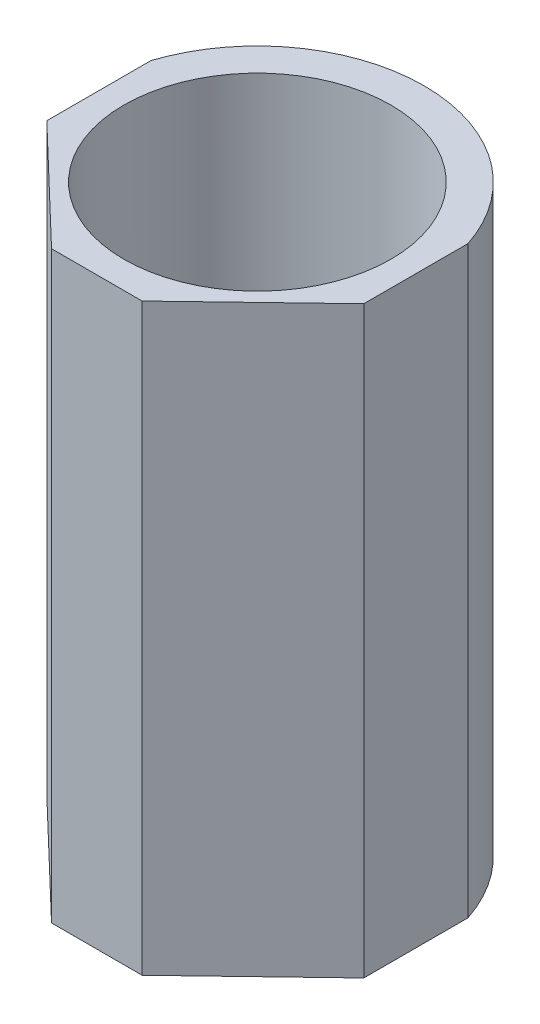
ISO-10303-21;
HEADER;
FILE_DESCRIPTION(('STEP AP214'),'2;1');
FILE_NAME('part.step','',(''),(''),'','','');
FILE_SCHEMA(('AUTOMOTIVE_DESIGN { 1 0 10303 214 1 1 1 1 }'));
ENDSEC;
DATA;
#1=APPLICATION_CONTEXT('core data for automotive mechanical design processes');
#2=APPLICATION_PROTOCOL_DEFINITION('international standard','automotive_design',2000,#1);
#3=PRODUCT_CONTEXT('',#1,'mechanical');
#4=PRODUCT('Part','Part','',(#3));
#5=PRODUCT_RELATED_PRODUCT_CATEGORY('part','',(#4));
#6=PRODUCT_DEFINITION_FORMATION('','',#4);
#7=PRODUCT_DEFINITION_CONTEXT('part definition',#1,'design');
#8=PRODUCT_DEFINITION('design','',#6,#7);
#9=PRODUCT_DEFINITION_SHAPE('','',#8);
#10=(LENGTH_UNIT() NAMED_UNIT(*) SI_UNIT(.MILLI.,.METRE.));
#11=(NAMED_UNIT(*) PLANE_ANGLE_UNIT() SI_UNIT($,.RADIAN.));
#12=(NAMED_UNIT(*) SI_UNIT($,.STERADIAN.) SOLID_ANGLE_UNIT());
#13=UNCERTAINTY_MEASURE_WITH_UNIT(LENGTH_MEASURE(1.E-05),#10,'distance_accuracy_value','');
#14=(GEOMETRIC_REPRESENTATION_CONTEXT(3) GLOBAL_UNCERTAINTY_ASSIGNED_CONTEXT((#13)) GLOBAL_UNIT_ASSIGNED_CONTEXT((#10,
#11,#12)) REPRESENTATION_CONTEXT('',''));
#15=CARTESIAN_POINT('',(0.,0.,0.));
#16=DIRECTION('',(0.,0.,1.));
#17=DIRECTION('',(1.,0.,0.));
#18=AXIS2_PLACEMENT_3D('',#15,#16,#17);
#19=CARTESIAN_POINT('',(0.,70.,0.));
#20=DIRECTION('',(0.,-1.,0.));
#21=DIRECTION('',(0.,0.,-1.));
#22=AXIS2_PLACEMENT_3D('',#19,#20,#21);
#23=CYLINDRICAL_SURFACE('',#22,16.01);
#24=CARTESIAN_POINT('',(0.,70.,0.));
#25=DIRECTION('',(0.,1.,0.));
#26=DIRECTION('',(0.,0.,1.));
#27=AXIS2_PLACEMENT_3D('',#24,#25,#26);
#28=CIRCLE('',#27,16.01);
#29=CARTESIAN_POINT('',(0.,70.,16.01));
#30=VERTEX_POINT('',#29);
#31=EDGE_CURVE('E145',#30,#30,#28,.T.);
#32=ORIENTED_EDGE('',*,*,#31,.T.);
#33=EDGE_LOOP('',(#32));
#34=FACE_BOUND('',#33,.T.);
#35=CARTESIAN_POINT('',(0.,30.,0.));
#36=DIRECTION('',(0.,-1.,0.));
#37=DIRECTION('',(0.,0.,-1.));
#38=AXIS2_PLACEMENT_3D('',#35,#36,#37);
#39=CIRCLE('',#38,16.01);
#40=CARTESIAN_POINT('',(0.,30.,-16.01));
#41=VERTEX_POINT('',#40);
#42=EDGE_CURVE('E169',#41,#41,#39,.T.);
#43=ORIENTED_EDGE('',*,*,#42,.T.);
#44=EDGE_LOOP('',(#43));
#45=FACE_BOUND('',#44,.T.);
#46=ADVANCED_FACE('F44',(#34,#45),#23,.F.);
#47=CARTESIAN_POINT('',(0.,70.,0.));
#48=DIRECTION('',(0.,1.,0.));
#49=DIRECTION('',(0.,0.,1.));
#50=AXIS2_PLACEMENT_3D('',#47,#48,#49);
#51=PLANE('',#50);
#52=ORIENTED_EDGE('',*,*,#31,.F.);
#53=EDGE_LOOP('',(#52));
#54=FACE_BOUND('',#53,.T.);
#55=DIRECTION('',(0.,0.,1.));
#56=VECTOR('',#55,1.);
#57=CARTESIAN_POINT('',(-19.,70.,0.));
#58=LINE('',#57,#56);
#59=CARTESIAN_POINT('',(-19.,70.,-6.24499799839843));
#60=VERTEX_POINT('',#59);
#61=CARTESIAN_POINT('',(-19.,70.,6.24499799839843));
#62=VERTEX_POINT('',#61);
#63=EDGE_CURVE('E64',#60,#62,#58,.T.);
#64=ORIENTED_EDGE('',*,*,#63,.T.);
#65=DIRECTION('',(0.722024119484244,0.,0.691867885425391));
#66=VECTOR('',#65,1.);
#67=CARTESIAN_POINT('',(-19.,70.,6.24499799839843));
#68=LINE('',#67,#66);
#69=CARTESIAN_POINT('',(-5.42920330043619,70.,19.2489935197281));
#70=VERTEX_POINT('',#69);
#71=EDGE_CURVE('E48',#62,#70,#68,.T.);
#72=ORIENTED_EDGE('',*,*,#71,.T.);
#73=DIRECTION('',(1.,0.,0.));
#74=VECTOR('',#73,1.);
#75=CARTESIAN_POINT('',(0.,70.,19.2489935197281));
#76=LINE('',#75,#74);
#77=CARTESIAN_POINT('',(5.42920330043619,70.,19.2489935197281));
#78=VERTEX_POINT('',#77);
#79=EDGE_CURVE('E153',#70,#78,#76,.T.);
#80=ORIENTED_EDGE('',*,*,#79,.T.);
#81=DIRECTION('',(-0.722024119484244,0.,0.691867885425391));
#82=VECTOR('',#81,1.);
#83=CARTESIAN_POINT('',(12.2146016502181,70.,12.7469957590632));
#84=LINE('',#83,#82);
#85=CARTESIAN_POINT('',(19.,70.,6.24499799839843));
#86=VERTEX_POINT('',#85);
#87=EDGE_CURVE('E80',#86,#78,#84,.T.);
#88=ORIENTED_EDGE('',*,*,#87,.F.);
#89=DIRECTION('',(0.,0.,1.));
#90=VECTOR('',#89,1.);
#91=CARTESIAN_POINT('',(19.,70.,0.));
#92=LINE('',#91,#90);
#93=CARTESIAN_POINT('',(19.,70.,-6.24499799839843));
#94=VERTEX_POINT('',#93);
#95=EDGE_CURVE('E114',#94,#86,#92,.T.);
#96=ORIENTED_EDGE('',*,*,#95,.F.);
#97=CARTESIAN_POINT('',(0.,70.,0.));
#98=DIRECTION('',(0.,1.,0.));
#99=DIRECTION('',(0.,0.,1.));
#100=AXIS2_PLACEMENT_3D('',#97,#98,#99);
#101=CIRCLE('',#100,20.);
#102=EDGE_CURVE('E12',#94,#60,#101,.T.);
#103=ORIENTED_EDGE('',*,*,#102,.T.);
#104=EDGE_LOOP('',(#64,#72,#80,#88,#96,#103));
#105=FACE_BOUND('',#104,.T.);
#106=ADVANCED_FACE('F175',(#54,#105),#51,.T.);
#107=CARTESIAN_POINT('',(0.,0.,0.));
#108=DIRECTION('',(0.,1.,0.));
#109=DIRECTION('',(0.,0.,1.));
#110=AXIS2_PLACEMENT_3D('',#107,#108,#109);
#111=PLANE('',#110);
#112=CARTESIAN_POINT('',(0.,0.,0.));
#113=DIRECTION('',(0.,1.,0.));
#114=DIRECTION('',(0.,0.,1.));
#115=AXIS2_PLACEMENT_3D('',#112,#113,#114);
#116=CIRCLE('',#115,3.326);
#117=CARTESIAN_POINT('',(0.,0.,3.326));
#118=VERTEX_POINT('',#117);
#119=EDGE_CURVE('E217',#118,#118,#116,.T.);
#120=ORIENTED_EDGE('',*,*,#119,.T.);
#121=EDGE_LOOP('',(#120));
#122=FACE_BOUND('',#121,.T.);
#123=DIRECTION('',(0.722024119484244,0.,0.691867885425391));
#124=VECTOR('',#123,1.);
#125=CARTESIAN_POINT('',(-12.2146016502181,0.,12.7469957590632));
#126=LINE('',#125,#124);
#127=CARTESIAN_POINT('',(-19.,0.,6.24499799839843));
#128=VERTEX_POINT('',#127);
#129=CARTESIAN_POINT('',(-5.42920330043618,0.,19.2489935197281));
#130=VERTEX_POINT('',#129);
#131=EDGE_CURVE('E110',#128,#130,#126,.T.);
#132=ORIENTED_EDGE('',*,*,#131,.F.);
#133=DIRECTION('',(0.,0.,1.));
#134=VECTOR('',#133,1.);
#135=CARTESIAN_POINT('',(-19.,0.,0.));
#136=LINE('',#135,#134);
#137=CARTESIAN_POINT('',(-19.,0.,-6.24499799839843));
#138=VERTEX_POINT('',#137);
#139=EDGE_CURVE('E120',#138,#128,#136,.T.);
#140=ORIENTED_EDGE('',*,*,#139,.F.);
#141=CARTESIAN_POINT('',(0.,0.,0.));
#142=DIRECTION('',(0.,1.,0.));
#143=DIRECTION('',(0.,0.,1.));
#144=AXIS2_PLACEMENT_3D('',#141,#142,#143);
#145=CIRCLE('',#144,20.);
#146=CARTESIAN_POINT('',(19.,0.,-6.24499799839843));
#147=VERTEX_POINT('',#146);
#148=EDGE_CURVE('E55',#147,#138,#145,.T.);
#149=ORIENTED_EDGE('',*,*,#148,.F.);
#150=DIRECTION('',(0.,0.,1.));
#151=VECTOR('',#150,1.);
#152=CARTESIAN_POINT('',(19.,0.,0.));
#153=LINE('',#152,#151);
#154=CARTESIAN_POINT('',(19.,0.,6.24499799839843));
#155=VERTEX_POINT('',#154);
#156=EDGE_CURVE('E139',#147,#155,#153,.T.);
#157=ORIENTED_EDGE('',*,*,#156,.T.);
#158=DIRECTION('',(-0.722024119484244,0.,0.691867885425391));
#159=VECTOR('',#158,1.);
#160=CARTESIAN_POINT('',(12.2146016502181,0.,12.7469957590632));
#161=LINE('',#160,#159);
#162=CARTESIAN_POINT('',(5.42920330043619,0.,19.2489935197281));
#163=VERTEX_POINT('',#162);
#164=EDGE_CURVE('E166',#155,#163,#161,.T.);
#165=ORIENTED_EDGE('',*,*,#164,.T.);
#166=DIRECTION('',(1.,0.,0.));
#167=VECTOR('',#166,1.);
#168=CARTESIAN_POINT('',(0.,0.,19.2489935197281));
#169=LINE('',#168,#167);
#170=EDGE_CURVE('E124',#130,#163,#169,.T.);
#171=ORIENTED_EDGE('',*,*,#170,.F.);
#172=EDGE_LOOP('',(#132,#140,#149,#157,#165,#171));
#173=FACE_BOUND('',#172,.T.);
#174=ADVANCED_FACE('F118',(#122,#173),#111,.F.);
#175=CARTESIAN_POINT('',(0.,70.,0.));
#176=DIRECTION('',(0.,-1.,0.));
#177=DIRECTION('',(0.,0.,-1.));
#178=AXIS2_PLACEMENT_3D('',#175,#176,#177);
#179=CYLINDRICAL_SURFACE('',#178,20.);
#180=DIRECTION('',(0.,1.,0.));
#181=VECTOR('',#180,1.);
#182=CARTESIAN_POINT('',(-19.,0.,-6.24499799839843));
#183=LINE('',#182,#181);
#184=EDGE_CURVE('E92',#138,#60,#183,.T.);
#185=ORIENTED_EDGE('',*,*,#184,.T.);
#186=ORIENTED_EDGE('',*,*,#102,.F.);
#187=DIRECTION('',(0.,1.,0.));
#188=VECTOR('',#187,1.);
#189=CARTESIAN_POINT('',(19.,0.,-6.24499799839843));
#190=LINE('',#189,#188);
#191=EDGE_CURVE('E88',#147,#94,#190,.T.);
#192=ORIENTED_EDGE('',*,*,#191,.F.);
#193=ORIENTED_EDGE('',*,*,#148,.T.);
#194=EDGE_LOOP('',(#185,#186,#192,#193));
#195=FACE_BOUND('',#194,.T.);
#196=ADVANCED_FACE('F46',(#195),#179,.T.);
#197=CARTESIAN_POINT('',(19.,0.,0.));
#198=DIRECTION('',(-1.,0.,0.));
#199=DIRECTION('',(0.,0.,1.));
#200=AXIS2_PLACEMENT_3D('',#197,#198,#199);
#201=PLANE('',#200);
#202=ORIENTED_EDGE('',*,*,#95,.T.);
#203=DIRECTION('',(0.,1.,0.));
#204=VECTOR('',#203,1.);
#205=CARTESIAN_POINT('',(19.,0.,6.24499799839843));
#206=LINE('',#205,#204);
#207=EDGE_CURVE('E168',#155,#86,#206,.T.);
#208=ORIENTED_EDGE('',*,*,#207,.F.);
#209=ORIENTED_EDGE('',*,*,#156,.F.);
#210=ORIENTED_EDGE('',*,*,#191,.T.);
#211=EDGE_LOOP('',(#202,#208,#209,#210));
#212=FACE_BOUND('',#211,.T.);
#213=ADVANCED_FACE('F177',(#212),#201,.F.);
#214=CARTESIAN_POINT('',(0.,0.,19.2489935197281));
#215=DIRECTION('',(0.,0.,1.));
#216=DIRECTION('',(1.,0.,0.));
#217=AXIS2_PLACEMENT_3D('',#214,#215,#216);
#218=PLANE('',#217);
#219=DIRECTION('',(0.,1.,0.));
#220=VECTOR('',#219,1.);
#221=CARTESIAN_POINT('',(-5.42920330043618,0.,19.2489935197281));
#222=LINE('',#221,#220);
#223=EDGE_CURVE('E126',#130,#70,#222,.T.);
#224=ORIENTED_EDGE('',*,*,#223,.F.);
#225=ORIENTED_EDGE('',*,*,#170,.T.);
#226=DIRECTION('',(0.,1.,0.));
#227=VECTOR('',#226,1.);
#228=CARTESIAN_POINT('',(5.42920330043619,0.,19.2489935197281));
#229=LINE('',#228,#227);
#230=EDGE_CURVE('E127',#163,#78,#229,.T.);
#231=ORIENTED_EDGE('',*,*,#230,.T.);
#232=ORIENTED_EDGE('',*,*,#79,.F.);
#233=EDGE_LOOP('',(#224,#225,#231,#232));
#234=FACE_BOUND('',#233,.T.);
#235=ADVANCED_FACE('F174',(#234),#218,.T.);
#236=CARTESIAN_POINT('',(-19.,0.,0.));
#237=DIRECTION('',(-1.,0.,0.));
#238=DIRECTION('',(0.,0.,1.));
#239=AXIS2_PLACEMENT_3D('',#236,#237,#238);
#240=PLANE('',#239);
#241=ORIENTED_EDGE('',*,*,#184,.F.);
#242=ORIENTED_EDGE('',*,*,#139,.T.);
#243=DIRECTION('',(0.,1.,0.));
#244=VECTOR('',#243,1.);
#245=CARTESIAN_POINT('',(-19.,0.,6.24499799839843));
#246=LINE('',#245,#244);
#247=EDGE_CURVE('E106',#128,#62,#246,.T.);
#248=ORIENTED_EDGE('',*,*,#247,.T.);
#249=ORIENTED_EDGE('',*,*,#63,.F.);
#250=EDGE_LOOP('',(#241,#242,#248,#249));
#251=FACE_BOUND('',#250,.T.);
#252=ADVANCED_FACE('F129',(#251),#240,.T.);
#253=CARTESIAN_POINT('',(-12.2146016502181,0.,12.7469957590632));
#254=DIRECTION('',(-0.691867885425391,0.,0.722024119484244));
#255=DIRECTION('',(0.722024119484244,0.,0.691867885425391));
#256=AXIS2_PLACEMENT_3D('',#253,#254,#255);
#257=PLANE('',#256);
#258=ORIENTED_EDGE('',*,*,#247,.F.);
#259=ORIENTED_EDGE('',*,*,#131,.T.);
#260=ORIENTED_EDGE('',*,*,#223,.T.);
#261=ORIENTED_EDGE('',*,*,#71,.F.);
#262=EDGE_LOOP('',(#258,#259,#260,#261));
#263=FACE_BOUND('',#262,.T.);
#264=ADVANCED_FACE('F108',(#263),#257,.T.);
#265=CARTESIAN_POINT('',(12.2146016502181,0.,12.7469957590632));
#266=DIRECTION('',(-0.691867885425391,0.,-0.722024119484244));
#267=DIRECTION('',(-0.722024119484244,0.,0.691867885425391));
#268=AXIS2_PLACEMENT_3D('',#265,#266,#267);
#269=PLANE('',#268);
#270=ORIENTED_EDGE('',*,*,#87,.T.);
#271=ORIENTED_EDGE('',*,*,#230,.F.);
#272=ORIENTED_EDGE('',*,*,#164,.F.);
#273=ORIENTED_EDGE('',*,*,#207,.T.);
#274=EDGE_LOOP('',(#270,#271,#272,#273));
#275=FACE_BOUND('',#274,.T.);
#276=ADVANCED_FACE('F200',(#275),#269,.F.);
#277=CARTESIAN_POINT('',(0.,30.,0.));
#278=DIRECTION('',(0.,-1.,0.));
#279=DIRECTION('',(0.,0.,-1.));
#280=AXIS2_PLACEMENT_3D('',#277,#278,#279);
#281=PLANE('',#280);
#282=CARTESIAN_POINT('',(0.,30.,0.));
#283=DIRECTION('',(0.,1.,0.));
#284=DIRECTION('',(0.,0.,1.));
#285=AXIS2_PLACEMENT_3D('',#282,#283,#284);
#286=CIRCLE('',#285,3.326);
#287=CARTESIAN_POINT('',(0.,30.,3.326));
#288=VERTEX_POINT('',#287);
#289=EDGE_CURVE('E220',#288,#288,#286,.T.);
#290=ORIENTED_EDGE('',*,*,#289,.F.);
#291=EDGE_LOOP('',(#290));
#292=FACE_BOUND('',#291,.T.);
#293=ORIENTED_EDGE('',*,*,#42,.F.);
#294=EDGE_LOOP('',(#293));
#295=FACE_BOUND('',#294,.T.);
#296=ADVANCED_FACE('F203',(#292,#295),#281,.F.);
#297=CARTESIAN_POINT('',(0.,0.,0.));
#298=DIRECTION('',(0.,1.,0.));
#299=DIRECTION('',(0.,0.,1.));
#300=AXIS2_PLACEMENT_3D('',#297,#298,#299);
#301=CYLINDRICAL_SURFACE('',#300,3.326);
#302=ORIENTED_EDGE('',*,*,#119,.F.);
#303=EDGE_LOOP('',(#302));
#304=FACE_BOUND('',#303,.T.);
#305=ORIENTED_EDGE('',*,*,#289,.T.);
#306=EDGE_LOOP('',(#305));
#307=FACE_BOUND('',#306,.T.);
#308=ADVANCED_FACE('F208',(#304,#307),#301,.F.);
#309=CLOSED_SHELL('',(#46,#106,#174,#196,#213,#235,#252,#264,#276,#296,#308));
#310=MANIFOLD_SOLID_BREP('B2',#309);
#311=ADVANCED_BREP_SHAPE_REPRESENTATION('',(#18,#310),#14);
#312=SHAPE_DEFINITION_REPRESENTATION(#9,#311);
ENDSEC;
END-ISO-10303-21;
